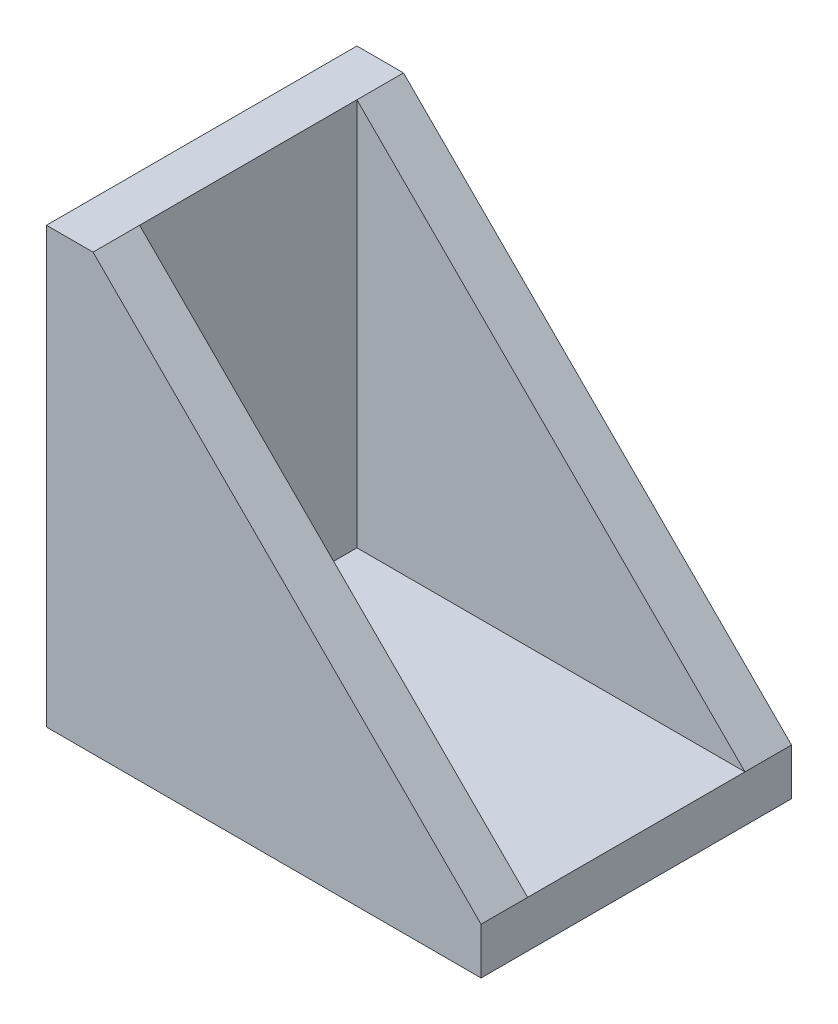
ISO-10303-21;
HEADER;
FILE_DESCRIPTION(('STEP AP214'),'2;1');
FILE_NAME('part.step','',(''),(''),'','','');
FILE_SCHEMA(('AUTOMOTIVE_DESIGN { 1 0 10303 214 1 1 1 1 }'));
ENDSEC;
DATA;
#1=APPLICATION_CONTEXT('core data for automotive mechanical design processes');
#2=APPLICATION_PROTOCOL_DEFINITION('international standard','automotive_design',2000,#1);
#3=PRODUCT_CONTEXT('',#1,'mechanical');
#4=PRODUCT('Part','Part','',(#3));
#5=PRODUCT_RELATED_PRODUCT_CATEGORY('part','',(#4));
#6=PRODUCT_DEFINITION_FORMATION('','',#4);
#7=PRODUCT_DEFINITION_CONTEXT('part definition',#1,'design');
#8=PRODUCT_DEFINITION('design','',#6,#7);
#9=PRODUCT_DEFINITION_SHAPE('','',#8);
#10=(LENGTH_UNIT() NAMED_UNIT(*) SI_UNIT(.MILLI.,.METRE.));
#11=(NAMED_UNIT(*) PLANE_ANGLE_UNIT() SI_UNIT($,.RADIAN.));
#12=(NAMED_UNIT(*) SI_UNIT($,.STERADIAN.) SOLID_ANGLE_UNIT());
#13=UNCERTAINTY_MEASURE_WITH_UNIT(LENGTH_MEASURE(1.E-05),#10,'distance_accuracy_value','');
#14=(GEOMETRIC_REPRESENTATION_CONTEXT(3) GLOBAL_UNCERTAINTY_ASSIGNED_CONTEXT((#13)) GLOBAL_UNIT_ASSIGNED_CONTEXT((#10,
#11,#12)) REPRESENTATION_CONTEXT('',''));
#15=CARTESIAN_POINT('',(0.,0.,0.));
#16=DIRECTION('',(0.,0.,1.));
#17=DIRECTION('',(1.,0.,0.));
#18=AXIS2_PLACEMENT_3D('',#15,#16,#17);
#19=CARTESIAN_POINT('',(3.,28.,10.));
#20=DIRECTION('',(-0.707106781186548,-0.707106781186548,0.));
#21=DIRECTION('',(0.707106781186548,-0.707106781186548,0.));
#22=AXIS2_PLACEMENT_3D('',#19,#20,#21);
#23=PLANE('',#22);
#24=DIRECTION('',(-0.707106781186548,0.707106781186548,0.));
#25=VECTOR('',#24,1.);
#26=CARTESIAN_POINT('',(15.5,15.5,-7.));
#27=LINE('',#26,#25);
#28=CARTESIAN_POINT('',(28.,3.,-7.));
#29=VERTEX_POINT('',#28);
#30=CARTESIAN_POINT('',(3.,28.,-7.));
#31=VERTEX_POINT('',#30);
#32=EDGE_CURVE('E154',#29,#31,#27,.T.);
#33=ORIENTED_EDGE('',*,*,#32,.F.);
#34=DIRECTION('',(0.,0.,-1.));
#35=VECTOR('',#34,1.);
#36=CARTESIAN_POINT('',(28.,3.,10.));
#37=LINE('',#36,#35);
#38=CARTESIAN_POINT('',(28.,3.,-10.));
#39=VERTEX_POINT('',#38);
#40=EDGE_CURVE('E41',#29,#39,#37,.T.);
#41=ORIENTED_EDGE('',*,*,#40,.T.);
#42=DIRECTION('',(-0.707106781186547,0.707106781186547,0.));
#43=VECTOR('',#42,1.);
#44=CARTESIAN_POINT('',(3.,28.,-10.));
#45=LINE('',#44,#43);
#46=CARTESIAN_POINT('',(3.,28.,-10.));
#47=VERTEX_POINT('',#46);
#48=EDGE_CURVE('E124',#39,#47,#45,.T.);
#49=ORIENTED_EDGE('',*,*,#48,.T.);
#50=DIRECTION('',(0.,0.,-1.));
#51=VECTOR('',#50,1.);
#52=CARTESIAN_POINT('',(3.,28.,10.));
#53=LINE('',#52,#51);
#54=EDGE_CURVE('E112',#31,#47,#53,.T.);
#55=ORIENTED_EDGE('',*,*,#54,.F.);
#56=EDGE_LOOP('',(#33,#41,#49,#55));
#57=FACE_BOUND('',#56,.T.);
#58=ADVANCED_FACE('F33',(#57),#23,.F.);
#59=CARTESIAN_POINT('',(28.,3.,10.));
#60=DIRECTION('',(-1.,0.,0.));
#61=DIRECTION('',(0.,0.,1.));
#62=AXIS2_PLACEMENT_3D('',#59,#60,#61);
#63=PLANE('',#62);
#64=DIRECTION('',(0.,1.,0.));
#65=VECTOR('',#64,1.);
#66=CARTESIAN_POINT('',(28.,3.,-10.));
#67=LINE('',#66,#65);
#68=CARTESIAN_POINT('',(28.,0.,-10.));
#69=VERTEX_POINT('',#68);
#70=EDGE_CURVE('E121',#69,#39,#67,.T.);
#71=ORIENTED_EDGE('',*,*,#70,.T.);
#72=ORIENTED_EDGE('',*,*,#40,.F.);
#73=DIRECTION('',(0.,0.,-1.));
#74=VECTOR('',#73,1.);
#75=CARTESIAN_POINT('',(28.,3.,10.));
#76=LINE('',#75,#74);
#77=CARTESIAN_POINT('',(28.,3.,7.));
#78=VERTEX_POINT('',#77);
#79=EDGE_CURVE('E125',#78,#29,#76,.T.);
#80=ORIENTED_EDGE('',*,*,#79,.F.);
#81=CARTESIAN_POINT('',(28.,3.,10.));
#82=VERTEX_POINT('',#81);
#83=EDGE_CURVE('E11',#82,#78,#37,.T.);
#84=ORIENTED_EDGE('',*,*,#83,.F.);
#85=DIRECTION('',(0.,1.,0.));
#86=VECTOR('',#85,1.);
#87=CARTESIAN_POINT('',(28.,3.,10.));
#88=LINE('',#87,#86);
#89=CARTESIAN_POINT('',(28.,0.,10.));
#90=VERTEX_POINT('',#89);
#91=EDGE_CURVE('E132',#90,#82,#88,.T.);
#92=ORIENTED_EDGE('',*,*,#91,.F.);
#93=DIRECTION('',(0.,0.,-1.));
#94=VECTOR('',#93,1.);
#95=CARTESIAN_POINT('',(28.,0.,10.));
#96=LINE('',#95,#94);
#97=EDGE_CURVE('E117',#90,#69,#96,.T.);
#98=ORIENTED_EDGE('',*,*,#97,.T.);
#99=EDGE_LOOP('',(#71,#72,#80,#84,#92,#98));
#100=FACE_BOUND('',#99,.T.);
#101=ADVANCED_FACE('F35',(#100),#63,.F.);
#102=ORIENTED_EDGE('',*,*,#83,.T.);
#103=DIRECTION('',(-0.707106781186548,0.707106781186548,0.));
#104=VECTOR('',#103,1.);
#105=CARTESIAN_POINT('',(15.5,15.5,7.));
#106=LINE('',#105,#104);
#107=CARTESIAN_POINT('',(3.,28.,7.));
#108=VERTEX_POINT('',#107);
#109=EDGE_CURVE('E158',#78,#108,#106,.T.);
#110=ORIENTED_EDGE('',*,*,#109,.T.);
#111=CARTESIAN_POINT('',(3.,28.,10.));
#112=VERTEX_POINT('',#111);
#113=EDGE_CURVE('E134',#112,#108,#53,.T.);
#114=ORIENTED_EDGE('',*,*,#113,.F.);
#115=DIRECTION('',(-0.707106781186547,0.707106781186547,0.));
#116=VECTOR('',#115,1.);
#117=CARTESIAN_POINT('',(3.,28.,10.));
#118=LINE('',#117,#116);
#119=EDGE_CURVE('E89',#82,#112,#118,.T.);
#120=ORIENTED_EDGE('',*,*,#119,.F.);
#121=EDGE_LOOP('',(#102,#110,#114,#120));
#122=FACE_BOUND('',#121,.T.);
#123=ADVANCED_FACE('F188',(#122),#23,.F.);
#124=CARTESIAN_POINT('',(0.,28.,10.));
#125=DIRECTION('',(0.,-1.,0.));
#126=DIRECTION('',(0.,0.,-1.));
#127=AXIS2_PLACEMENT_3D('',#124,#125,#126);
#128=PLANE('',#127);
#129=DIRECTION('',(-1.,0.,0.));
#130=VECTOR('',#129,1.);
#131=CARTESIAN_POINT('',(0.,28.,-10.));
#132=LINE('',#131,#130);
#133=CARTESIAN_POINT('',(0.,28.,-10.));
#134=VERTEX_POINT('',#133);
#135=EDGE_CURVE('E109',#47,#134,#132,.T.);
#136=ORIENTED_EDGE('',*,*,#135,.T.);
#137=DIRECTION('',(0.,0.,-1.));
#138=VECTOR('',#137,1.);
#139=CARTESIAN_POINT('',(0.,28.,10.));
#140=LINE('',#139,#138);
#141=CARTESIAN_POINT('',(0.,28.,10.));
#142=VERTEX_POINT('',#141);
#143=EDGE_CURVE('E106',#142,#134,#140,.T.);
#144=ORIENTED_EDGE('',*,*,#143,.F.);
#145=DIRECTION('',(-1.,0.,0.));
#146=VECTOR('',#145,1.);
#147=CARTESIAN_POINT('',(0.,28.,10.));
#148=LINE('',#147,#146);
#149=EDGE_CURVE('E96',#112,#142,#148,.T.);
#150=ORIENTED_EDGE('',*,*,#149,.F.);
#151=ORIENTED_EDGE('',*,*,#113,.T.);
#152=DIRECTION('',(0.,0.,-1.));
#153=VECTOR('',#152,1.);
#154=CARTESIAN_POINT('',(3.,28.,10.));
#155=LINE('',#154,#153);
#156=EDGE_CURVE('E139',#108,#31,#155,.T.);
#157=ORIENTED_EDGE('',*,*,#156,.T.);
#158=ORIENTED_EDGE('',*,*,#54,.T.);
#159=EDGE_LOOP('',(#136,#144,#150,#151,#157,#158));
#160=FACE_BOUND('',#159,.T.);
#161=ADVANCED_FACE('F107',(#160),#128,.F.);
#162=CARTESIAN_POINT('',(0.,0.,10.));
#163=DIRECTION('',(1.,0.,0.));
#164=DIRECTION('',(0.,0.,-1.));
#165=AXIS2_PLACEMENT_3D('',#162,#163,#164);
#166=PLANE('',#165);
#167=DIRECTION('',(0.,-1.,0.));
#168=VECTOR('',#167,1.);
#169=CARTESIAN_POINT('',(0.,0.,-10.));
#170=LINE('',#169,#168);
#171=CARTESIAN_POINT('',(0.,0.,-10.));
#172=VERTEX_POINT('',#171);
#173=EDGE_CURVE('E129',#134,#172,#170,.T.);
#174=ORIENTED_EDGE('',*,*,#173,.T.);
#175=DIRECTION('',(0.,0.,-1.));
#176=VECTOR('',#175,1.);
#177=CARTESIAN_POINT('',(0.,0.,10.));
#178=LINE('',#177,#176);
#179=CARTESIAN_POINT('',(0.,0.,10.));
#180=VERTEX_POINT('',#179);
#181=EDGE_CURVE('E113',#180,#172,#178,.T.);
#182=ORIENTED_EDGE('',*,*,#181,.F.);
#183=DIRECTION('',(0.,-1.,0.));
#184=VECTOR('',#183,1.);
#185=CARTESIAN_POINT('',(0.,0.,10.));
#186=LINE('',#185,#184);
#187=EDGE_CURVE('E100',#142,#180,#186,.T.);
#188=ORIENTED_EDGE('',*,*,#187,.F.);
#189=ORIENTED_EDGE('',*,*,#143,.T.);
#190=EDGE_LOOP('',(#174,#182,#188,#189));
#191=FACE_BOUND('',#190,.T.);
#192=ADVANCED_FACE('F115',(#191),#166,.F.);
#193=CARTESIAN_POINT('',(28.,0.,10.));
#194=DIRECTION('',(0.,1.,0.));
#195=DIRECTION('',(-1.,0.,0.));
#196=AXIS2_PLACEMENT_3D('',#193,#194,#195);
#197=PLANE('',#196);
#198=DIRECTION('',(1.,0.,0.));
#199=VECTOR('',#198,1.);
#200=CARTESIAN_POINT('',(28.,0.,-10.));
#201=LINE('',#200,#199);
#202=EDGE_CURVE('E81',#172,#69,#201,.T.);
#203=ORIENTED_EDGE('',*,*,#202,.T.);
#204=ORIENTED_EDGE('',*,*,#97,.F.);
#205=DIRECTION('',(1.,0.,0.));
#206=VECTOR('',#205,1.);
#207=CARTESIAN_POINT('',(28.,0.,10.));
#208=LINE('',#207,#206);
#209=EDGE_CURVE('E57',#180,#90,#208,.T.);
#210=ORIENTED_EDGE('',*,*,#209,.F.);
#211=ORIENTED_EDGE('',*,*,#181,.T.);
#212=EDGE_LOOP('',(#203,#204,#210,#211));
#213=FACE_BOUND('',#212,.T.);
#214=ADVANCED_FACE('F147',(#213),#197,.F.);
#215=CARTESIAN_POINT('',(0.,0.,10.));
#216=DIRECTION('',(0.,0.,-1.));
#217=DIRECTION('',(-1.,0.,0.));
#218=AXIS2_PLACEMENT_3D('',#215,#216,#217);
#219=PLANE('',#218);
#220=ORIENTED_EDGE('',*,*,#91,.T.);
#221=ORIENTED_EDGE('',*,*,#119,.T.);
#222=ORIENTED_EDGE('',*,*,#149,.T.);
#223=ORIENTED_EDGE('',*,*,#187,.T.);
#224=ORIENTED_EDGE('',*,*,#209,.T.);
#225=EDGE_LOOP('',(#220,#221,#222,#223,#224));
#226=FACE_BOUND('',#225,.T.);
#227=ADVANCED_FACE('F98',(#226),#219,.F.);
#228=CARTESIAN_POINT('',(0.,0.,-10.));
#229=DIRECTION('',(0.,0.,-1.));
#230=DIRECTION('',(-1.,0.,0.));
#231=AXIS2_PLACEMENT_3D('',#228,#229,#230);
#232=PLANE('',#231);
#233=ORIENTED_EDGE('',*,*,#70,.F.);
#234=ORIENTED_EDGE('',*,*,#202,.F.);
#235=ORIENTED_EDGE('',*,*,#173,.F.);
#236=ORIENTED_EDGE('',*,*,#135,.F.);
#237=ORIENTED_EDGE('',*,*,#48,.F.);
#238=EDGE_LOOP('',(#233,#234,#235,#236,#237));
#239=FACE_BOUND('',#238,.T.);
#240=ADVANCED_FACE('F146',(#239),#232,.T.);
#241=CARTESIAN_POINT('',(3.,0.,10.));
#242=DIRECTION('',(1.,0.,0.));
#243=DIRECTION('',(0.,0.,-1.));
#244=AXIS2_PLACEMENT_3D('',#241,#242,#243);
#245=PLANE('',#244);
#246=DIRECTION('',(0.,-1.,0.));
#247=VECTOR('',#246,1.);
#248=CARTESIAN_POINT('',(3.,0.,-7.));
#249=LINE('',#248,#247);
#250=CARTESIAN_POINT('',(3.,3.,-7.));
#251=VERTEX_POINT('',#250);
#252=EDGE_CURVE('E157',#31,#251,#249,.T.);
#253=ORIENTED_EDGE('',*,*,#252,.F.);
#254=ORIENTED_EDGE('',*,*,#156,.F.);
#255=DIRECTION('',(0.,-1.,0.));
#256=VECTOR('',#255,1.);
#257=CARTESIAN_POINT('',(3.,0.,7.));
#258=LINE('',#257,#256);
#259=CARTESIAN_POINT('',(3.,3.,7.));
#260=VERTEX_POINT('',#259);
#261=EDGE_CURVE('E161',#108,#260,#258,.T.);
#262=ORIENTED_EDGE('',*,*,#261,.T.);
#263=DIRECTION('',(0.,0.,-1.));
#264=VECTOR('',#263,1.);
#265=CARTESIAN_POINT('',(3.,3.,10.));
#266=LINE('',#265,#264);
#267=EDGE_CURVE('E164',#260,#251,#266,.T.);
#268=ORIENTED_EDGE('',*,*,#267,.T.);
#269=EDGE_LOOP('',(#253,#254,#262,#268));
#270=FACE_BOUND('',#269,.T.);
#271=ADVANCED_FACE('F182',(#270),#245,.T.);
#272=CARTESIAN_POINT('',(28.,3.,10.));
#273=DIRECTION('',(0.,1.,0.));
#274=DIRECTION('',(-1.,0.,0.));
#275=AXIS2_PLACEMENT_3D('',#272,#273,#274);
#276=PLANE('',#275);
#277=DIRECTION('',(1.,0.,0.));
#278=VECTOR('',#277,1.);
#279=CARTESIAN_POINT('',(0.,3.,-7.));
#280=LINE('',#279,#278);
#281=EDGE_CURVE('E162',#251,#29,#280,.T.);
#282=ORIENTED_EDGE('',*,*,#281,.F.);
#283=ORIENTED_EDGE('',*,*,#267,.F.);
#284=DIRECTION('',(1.,0.,0.));
#285=VECTOR('',#284,1.);
#286=CARTESIAN_POINT('',(0.,3.,7.));
#287=LINE('',#286,#285);
#288=EDGE_CURVE('E48',#260,#78,#287,.T.);
#289=ORIENTED_EDGE('',*,*,#288,.T.);
#290=ORIENTED_EDGE('',*,*,#79,.T.);
#291=EDGE_LOOP('',(#282,#283,#289,#290));
#292=FACE_BOUND('',#291,.T.);
#293=ADVANCED_FACE('F176',(#292),#276,.T.);
#294=CARTESIAN_POINT('',(0.,0.,7.));
#295=DIRECTION('',(0.,0.,-1.));
#296=DIRECTION('',(-1.,0.,0.));
#297=AXIS2_PLACEMENT_3D('',#294,#295,#296);
#298=PLANE('',#297);
#299=ORIENTED_EDGE('',*,*,#288,.F.);
#300=ORIENTED_EDGE('',*,*,#261,.F.);
#301=ORIENTED_EDGE('',*,*,#109,.F.);
#302=EDGE_LOOP('',(#299,#300,#301));
#303=FACE_BOUND('',#302,.T.);
#304=ADVANCED_FACE('F187',(#303),#298,.T.);
#305=CARTESIAN_POINT('',(0.,0.,-7.));
#306=DIRECTION('',(0.,0.,-1.));
#307=DIRECTION('',(-1.,0.,0.));
#308=AXIS2_PLACEMENT_3D('',#305,#306,#307);
#309=PLANE('',#308);
#310=ORIENTED_EDGE('',*,*,#32,.T.);
#311=ORIENTED_EDGE('',*,*,#252,.T.);
#312=ORIENTED_EDGE('',*,*,#281,.T.);
#313=EDGE_LOOP('',(#310,#311,#312));
#314=FACE_BOUND('',#313,.T.);
#315=ADVANCED_FACE('F180',(#314),#309,.F.);
#316=CLOSED_SHELL('',(#58,#101,#123,#161,#192,#214,#227,#240,#271,#293,#304,#315));
#317=MANIFOLD_SOLID_BREP('B2',#316);
#318=ADVANCED_BREP_SHAPE_REPRESENTATION('',(#18,#317),#14);
#319=SHAPE_DEFINITION_REPRESENTATION(#9,#318);
ENDSEC;
END-ISO-10303-21;
